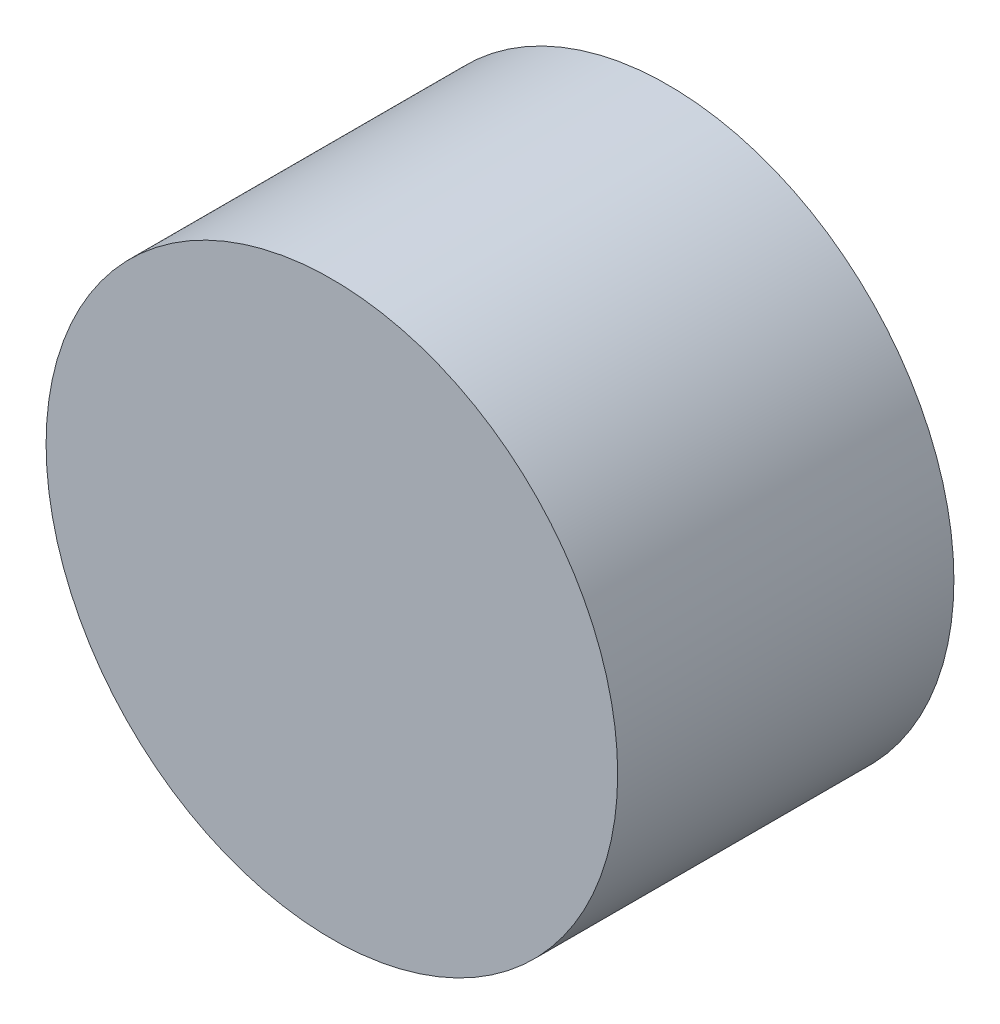
ISO-10303-21;
HEADER;
FILE_DESCRIPTION(('STEP AP214'),'2;1');
FILE_NAME('part.step','',(''),(''),'','','');
FILE_SCHEMA(('AUTOMOTIVE_DESIGN { 1 0 10303 214 1 1 1 1 }'));
ENDSEC;
DATA;
#1=APPLICATION_CONTEXT('core data for automotive mechanical design processes');
#2=APPLICATION_PROTOCOL_DEFINITION('international standard','automotive_design',2000,#1);
#3=PRODUCT_CONTEXT('',#1,'mechanical');
#4=PRODUCT('Part','Part','',(#3));
#5=PRODUCT_RELATED_PRODUCT_CATEGORY('part','',(#4));
#6=PRODUCT_DEFINITION_FORMATION('','',#4);
#7=PRODUCT_DEFINITION_CONTEXT('part definition',#1,'design');
#8=PRODUCT_DEFINITION('design','',#6,#7);
#9=PRODUCT_DEFINITION_SHAPE('','',#8);
#10=(LENGTH_UNIT() NAMED_UNIT(*) SI_UNIT(.MILLI.,.METRE.));
#11=(NAMED_UNIT(*) PLANE_ANGLE_UNIT() SI_UNIT($,.RADIAN.));
#12=(NAMED_UNIT(*) SI_UNIT($,.STERADIAN.) SOLID_ANGLE_UNIT());
#13=UNCERTAINTY_MEASURE_WITH_UNIT(LENGTH_MEASURE(1.E-05),#10,'distance_accuracy_value','');
#14=(GEOMETRIC_REPRESENTATION_CONTEXT(3) GLOBAL_UNCERTAINTY_ASSIGNED_CONTEXT((#13)) GLOBAL_UNIT_ASSIGNED_CONTEXT((#10,
#11,#12)) REPRESENTATION_CONTEXT('',''));
#15=CARTESIAN_POINT('',(0.,0.,0.));
#16=DIRECTION('',(0.,0.,1.));
#17=DIRECTION('',(1.,0.,0.));
#18=AXIS2_PLACEMENT_3D('',#15,#16,#17);
#19=CARTESIAN_POINT('',(0.,0.,2.));
#20=DIRECTION('',(0.,0.,-1.));
#21=DIRECTION('',(-1.,0.,0.));
#22=AXIS2_PLACEMENT_3D('',#19,#20,#21);
#23=CYLINDRICAL_SURFACE('',#22,1.7);
#24=CARTESIAN_POINT('',(0.,0.,2.));
#25=DIRECTION('',(0.,0.,1.));
#26=DIRECTION('',(1.,0.,0.));
#27=AXIS2_PLACEMENT_3D('',#24,#25,#26);
#28=CIRCLE('',#27,1.7);
#29=CARTESIAN_POINT('',(1.7,0.,2.));
#30=VERTEX_POINT('',#29);
#31=EDGE_CURVE('E10',#30,#30,#28,.T.);
#32=ORIENTED_EDGE('',*,*,#31,.F.);
#33=EDGE_LOOP('',(#32));
#34=FACE_BOUND('',#33,.T.);
#35=CARTESIAN_POINT('',(0.,0.,0.));
#36=DIRECTION('',(0.,0.,1.));
#37=DIRECTION('',(1.,0.,0.));
#38=AXIS2_PLACEMENT_3D('',#35,#36,#37);
#39=CIRCLE('',#38,1.7);
#40=CARTESIAN_POINT('',(1.7,0.,0.));
#41=VERTEX_POINT('',#40);
#42=EDGE_CURVE('E33',#41,#41,#39,.T.);
#43=ORIENTED_EDGE('',*,*,#42,.T.);
#44=EDGE_LOOP('',(#43));
#45=FACE_BOUND('',#44,.T.);
#46=ADVANCED_FACE('F30',(#34,#45),#23,.T.);
#47=CARTESIAN_POINT('',(0.,0.,2.));
#48=DIRECTION('',(0.,0.,1.));
#49=DIRECTION('',(1.,0.,0.));
#50=AXIS2_PLACEMENT_3D('',#47,#48,#49);
#51=PLANE('',#50);
#52=ORIENTED_EDGE('',*,*,#31,.T.);
#53=EDGE_LOOP('',(#52));
#54=FACE_BOUND('',#53,.T.);
#55=ADVANCED_FACE('F45',(#54),#51,.T.);
#56=CARTESIAN_POINT('',(0.,0.,0.));
#57=DIRECTION('',(0.,0.,1.));
#58=DIRECTION('',(1.,0.,0.));
#59=AXIS2_PLACEMENT_3D('',#56,#57,#58);
#60=PLANE('',#59);
#61=ORIENTED_EDGE('',*,*,#42,.F.);
#62=EDGE_LOOP('',(#61));
#63=FACE_BOUND('',#62,.T.);
#64=ADVANCED_FACE('F43',(#63),#60,.F.);
#65=CLOSED_SHELL('',(#46,#55,#64));
#66=MANIFOLD_SOLID_BREP('B2',#65);
#67=ADVANCED_BREP_SHAPE_REPRESENTATION('',(#18,#66),#14);
#68=SHAPE_DEFINITION_REPRESENTATION(#9,#67);
ENDSEC;
END-ISO-10303-21;
